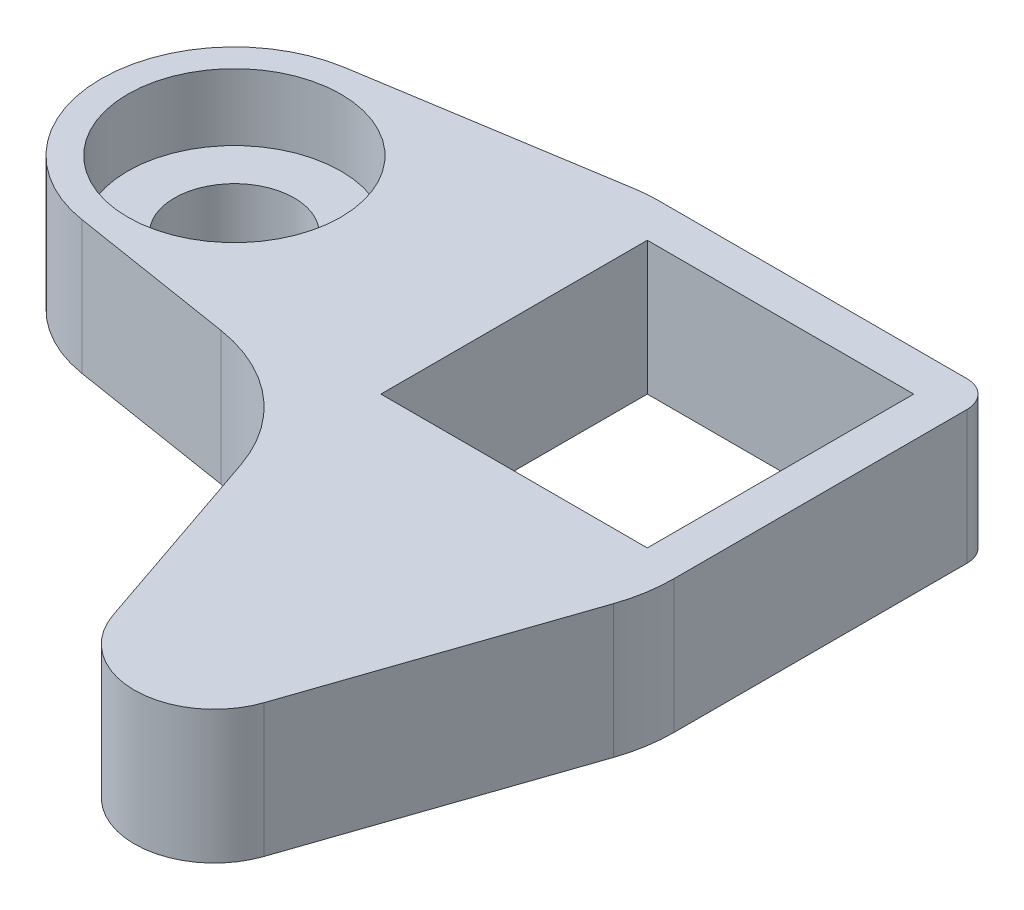
ISO-10303-21;
HEADER;
FILE_DESCRIPTION(('STEP AP214'),'2;1');
FILE_NAME('part.step','',(''),(''),'','','');
FILE_SCHEMA(('AUTOMOTIVE_DESIGN { 1 0 10303 214 1 1 1 1 }'));
ENDSEC;
DATA;
#1=APPLICATION_CONTEXT('core data for automotive mechanical design processes');
#2=APPLICATION_PROTOCOL_DEFINITION('international standard','automotive_design',2000,#1);
#3=PRODUCT_CONTEXT('',#1,'mechanical');
#4=PRODUCT('Part','Part','',(#3));
#5=PRODUCT_RELATED_PRODUCT_CATEGORY('part','',(#4));
#6=PRODUCT_DEFINITION_FORMATION('','',#4);
#7=PRODUCT_DEFINITION_CONTEXT('part definition',#1,'design');
#8=PRODUCT_DEFINITION('design','',#6,#7);
#9=PRODUCT_DEFINITION_SHAPE('','',#8);
#10=(LENGTH_UNIT() NAMED_UNIT(*) SI_UNIT(.MILLI.,.METRE.));
#11=(NAMED_UNIT(*) PLANE_ANGLE_UNIT() SI_UNIT($,.RADIAN.));
#12=(NAMED_UNIT(*) SI_UNIT($,.STERADIAN.) SOLID_ANGLE_UNIT());
#13=UNCERTAINTY_MEASURE_WITH_UNIT(LENGTH_MEASURE(1.E-05),#10,'distance_accuracy_value','');
#14=(GEOMETRIC_REPRESENTATION_CONTEXT(3) GLOBAL_UNCERTAINTY_ASSIGNED_CONTEXT((#13)) GLOBAL_UNIT_ASSIGNED_CONTEXT((#10,
#11,#12)) REPRESENTATION_CONTEXT('',''));
#15=CARTESIAN_POINT('',(0.,0.,0.));
#16=DIRECTION('',(0.,0.,1.));
#17=DIRECTION('',(1.,0.,0.));
#18=AXIS2_PLACEMENT_3D('',#15,#16,#17);
#19=CARTESIAN_POINT('',(-5.,10.,-1.));
#20=DIRECTION('',(0.,-1.,0.));
#21=DIRECTION('',(0.,0.,-1.));
#22=AXIS2_PLACEMENT_3D('',#19,#20,#21);
#23=PLANE('',#22);
#24=CARTESIAN_POINT('',(-47.,10.,10.));
#25=DIRECTION('',(0.,1.,0.));
#26=DIRECTION('',(0.,0.,-1.));
#27=AXIS2_PLACEMENT_3D('',#24,#25,#26);
#28=CIRCLE('',#27,8.);
#29=CARTESIAN_POINT('',(-47.,10.,2.00000000000001));
#30=VERTEX_POINT('',#29);
#31=EDGE_CURVE('E202',#30,#30,#28,.F.);
#32=ORIENTED_EDGE('',*,*,#31,.T.);
#33=EDGE_LOOP('',(#32));
#34=FACE_BOUND('',#33,.T.);
#35=CARTESIAN_POINT('',(-5.,10.,-1.));
#36=DIRECTION('',(0.,-1.,0.));
#37=DIRECTION('',(0.,0.,-1.));
#38=AXIS2_PLACEMENT_3D('',#35,#36,#37);
#39=CIRCLE('',#38,2.);
#40=CARTESIAN_POINT('',(-5.,10.,-3.));
#41=VERTEX_POINT('',#40);
#42=CARTESIAN_POINT('',(-3.,10.,-1.));
#43=VERTEX_POINT('',#42);
#44=EDGE_CURVE('E213',#41,#43,#39,.T.);
#45=ORIENTED_EDGE('',*,*,#44,.F.);
#46=DIRECTION('',(1.,0.,0.));
#47=VECTOR('',#46,1.);
#48=CARTESIAN_POINT('',(-5.,10.,-3.));
#49=LINE('',#48,#47);
#50=CARTESIAN_POINT('',(-28.0482290774266,10.,-3.));
#51=VERTEX_POINT('',#50);
#52=EDGE_CURVE('E258',#51,#41,#49,.T.);
#53=ORIENTED_EDGE('',*,*,#52,.F.);
#54=CARTESIAN_POINT('',(-28.0482290774266,10.,9.));
#55=DIRECTION('',(0.,-1.,0.));
#56=DIRECTION('',(0.,0.,1.));
#57=AXIS2_PLACEMENT_3D('',#54,#55,#56);
#58=CIRCLE('',#57,12.);
#59=CARTESIAN_POINT('',(-29.9398710771213,10.,-2.849965845731));
#60=VERTEX_POINT('',#59);
#61=EDGE_CURVE('E254',#60,#51,#58,.T.);
#62=ORIENTED_EDGE('',*,*,#61,.F.);
#63=DIRECTION('',(0.987497153810917,0.,-0.157636833307885));
#64=VECTOR('',#63,1.);
#65=CARTESIAN_POINT('',(-29.9398710771213,10.,-2.849965845731));
#66=LINE('',#65,#64);
#67=CARTESIAN_POINT('',(-48.5763683330788,10.,0.125028461890824));
#68=VERTEX_POINT('',#67);
#69=EDGE_CURVE('E250',#68,#60,#66,.T.);
#70=ORIENTED_EDGE('',*,*,#69,.F.);
#71=CARTESIAN_POINT('',(-47.,10.,10.));
#72=DIRECTION('',(0.,-1.,0.));
#73=DIRECTION('',(0.,0.,1.));
#74=AXIS2_PLACEMENT_3D('',#71,#72,#73);
#75=CIRCLE('',#74,10.);
#76=CARTESIAN_POINT('',(-48.5763683330788,10.,19.8749715381092));
#77=VERTEX_POINT('',#76);
#78=EDGE_CURVE('E246',#77,#68,#75,.T.);
#79=ORIENTED_EDGE('',*,*,#78,.F.);
#80=DIRECTION('',(-0.987497153810917,0.,-0.157636833307885));
#81=VECTOR('',#80,1.);
#82=CARTESIAN_POINT('',(-36.1305887585279,10.,21.861724889862));
#83=LINE('',#82,#81);
#84=CARTESIAN_POINT('',(-36.1305887585279,10.,21.861724889862));
#85=VERTEX_POINT('',#84);
#86=EDGE_CURVE('E242',#85,#77,#83,.T.);
#87=ORIENTED_EDGE('',*,*,#86,.F.);
#88=CARTESIAN_POINT('',(-38.0222307582225,10.,33.711690735593));
#89=DIRECTION('',(0.,1.,0.));
#90=DIRECTION('',(0.,0.,1.));
#91=AXIS2_PLACEMENT_3D('',#88,#89,#90);
#92=CIRCLE('',#91,12.);
#93=CARTESIAN_POINT('',(-26.6662452592514,10.,29.8333414285865));
#94=VERTEX_POINT('',#93);
#95=EDGE_CURVE('E238',#94,#85,#92,.T.);
#96=ORIENTED_EDGE('',*,*,#95,.F.);
#97=DIRECTION('',(-0.323195775583867,0.,-0.946332124914262));
#98=VECTOR('',#97,1.);
#99=CARTESIAN_POINT('',(-26.6662452592514,10.,29.8333414285865));
#100=LINE('',#99,#98);
#101=CARTESIAN_POINT('',(-21.6779927494856,10.,44.4391746535032));
#102=VERTEX_POINT('',#101);
#103=EDGE_CURVE('E234',#102,#94,#100,.T.);
#104=ORIENTED_EDGE('',*,*,#103,.F.);
#105=CARTESIAN_POINT('',(-16.,10.,42.5));
#106=DIRECTION('',(0.,-1.,0.));
#107=DIRECTION('',(0.,0.,1.));
#108=AXIS2_PLACEMENT_3D('',#105,#106,#107);
#109=CIRCLE('',#108,6.);
#110=CARTESIAN_POINT('',(-10.3220072505144,10.,44.4391746535032));
#111=VERTEX_POINT('',#110);
#112=EDGE_CURVE('E230',#111,#102,#109,.T.);
#113=ORIENTED_EDGE('',*,*,#112,.F.);
#114=DIRECTION('',(-0.323195775583867,0.,0.946332124914262));
#115=VECTOR('',#114,1.);
#116=CARTESIAN_POINT('',(-3.64401450102886,10.,24.885704137479));
#117=LINE('',#116,#115);
#118=CARTESIAN_POINT('',(-3.64401450102885,10.,24.885704137479));
#119=VERTEX_POINT('',#118);
#120=EDGE_CURVE('E226',#119,#111,#117,.T.);
#121=ORIENTED_EDGE('',*,*,#120,.F.);
#122=CARTESIAN_POINT('',(-15.,10.,21.0073548304726));
#123=DIRECTION('',(0.,-1.,0.));
#124=DIRECTION('',(0.,0.,1.));
#125=AXIS2_PLACEMENT_3D('',#122,#123,#124);
#126=CIRCLE('',#125,12.);
#127=CARTESIAN_POINT('',(-3.,10.,21.0073548304726));
#128=VERTEX_POINT('',#127);
#129=EDGE_CURVE('E222',#128,#119,#126,.T.);
#130=ORIENTED_EDGE('',*,*,#129,.F.);
#131=DIRECTION('',(0.,0.,1.));
#132=VECTOR('',#131,1.);
#133=CARTESIAN_POINT('',(-3.,10.,21.0073548304726));
#134=LINE('',#133,#132);
#135=EDGE_CURVE('E217',#43,#128,#134,.T.);
#136=ORIENTED_EDGE('',*,*,#135,.F.);
#137=EDGE_LOOP('',(#45,#53,#62,#70,#79,#87,#96,#104,#113,#121,#130,#136));
#138=FACE_BOUND('',#137,.T.);
#139=DIRECTION('',(0.,0.,-1.));
#140=VECTOR('',#139,1.);
#141=CARTESIAN_POINT('',(-26.,10.,20.));
#142=LINE('',#141,#140);
#143=CARTESIAN_POINT('',(-26.,10.,20.));
#144=VERTEX_POINT('',#143);
#145=CARTESIAN_POINT('',(-26.,10.,0.));
#146=VERTEX_POINT('',#145);
#147=EDGE_CURVE('E165',#144,#146,#142,.T.);
#148=ORIENTED_EDGE('',*,*,#147,.T.);
#149=DIRECTION('',(1.,0.,0.));
#150=VECTOR('',#149,1.);
#151=CARTESIAN_POINT('',(-6.,10.,0.));
#152=LINE('',#151,#150);
#153=CARTESIAN_POINT('',(-6.,10.,0.));
#154=VERTEX_POINT('',#153);
#155=EDGE_CURVE('E175',#146,#154,#152,.T.);
#156=ORIENTED_EDGE('',*,*,#155,.T.);
#157=DIRECTION('',(0.,0.,1.));
#158=VECTOR('',#157,1.);
#159=CARTESIAN_POINT('',(-6.,10.,20.));
#160=LINE('',#159,#158);
#161=CARTESIAN_POINT('',(-6.,10.,20.));
#162=VERTEX_POINT('',#161);
#163=EDGE_CURVE('E180',#154,#162,#160,.T.);
#164=ORIENTED_EDGE('',*,*,#163,.T.);
#165=DIRECTION('',(-1.,0.,0.));
#166=VECTOR('',#165,1.);
#167=CARTESIAN_POINT('',(-6.,10.,20.));
#168=LINE('',#167,#166);
#169=EDGE_CURVE('E183',#162,#144,#168,.T.);
#170=ORIENTED_EDGE('',*,*,#169,.T.);
#171=EDGE_LOOP('',(#148,#156,#164,#170));
#172=FACE_BOUND('',#171,.T.);
#173=ADVANCED_FACE('F47',(#34,#138,#172),#23,.F.);
#174=CARTESIAN_POINT('',(-5.,0.,-1.));
#175=DIRECTION('',(0.,-1.,0.));
#176=DIRECTION('',(0.,0.,-1.));
#177=AXIS2_PLACEMENT_3D('',#174,#175,#176);
#178=PLANE('',#177);
#179=CARTESIAN_POINT('',(-16.,0.,42.5));
#180=DIRECTION('',(0.,1.,0.));
#181=DIRECTION('',(0.,0.,-1.));
#182=AXIS2_PLACEMENT_3D('',#179,#180,#181);
#183=CIRCLE('',#182,4.00000000000001);
#184=CARTESIAN_POINT('',(-16.,0.,38.5));
#185=VERTEX_POINT('',#184);
#186=EDGE_CURVE('E51',#185,#185,#183,.T.);
#187=ORIENTED_EDGE('',*,*,#186,.T.);
#188=EDGE_LOOP('',(#187));
#189=FACE_BOUND('',#188,.T.);
#190=CARTESIAN_POINT('',(-47.,0.,10.));
#191=DIRECTION('',(0.,1.,0.));
#192=DIRECTION('',(0.,0.,-1.));
#193=AXIS2_PLACEMENT_3D('',#190,#191,#192);
#194=CIRCLE('',#193,4.5);
#195=CARTESIAN_POINT('',(-47.,0.,5.5));
#196=VERTEX_POINT('',#195);
#197=EDGE_CURVE('E342',#196,#196,#194,.T.);
#198=ORIENTED_EDGE('',*,*,#197,.T.);
#199=EDGE_LOOP('',(#198));
#200=FACE_BOUND('',#199,.T.);
#201=CARTESIAN_POINT('',(-5.,0.,-1.));
#202=DIRECTION('',(0.,-1.,0.));
#203=DIRECTION('',(0.,0.,-1.));
#204=AXIS2_PLACEMENT_3D('',#201,#202,#203);
#205=CIRCLE('',#204,2.);
#206=CARTESIAN_POINT('',(-5.,0.,-3.));
#207=VERTEX_POINT('',#206);
#208=CARTESIAN_POINT('',(-3.,0.,-1.));
#209=VERTEX_POINT('',#208);
#210=EDGE_CURVE('E171',#207,#209,#205,.T.);
#211=ORIENTED_EDGE('',*,*,#210,.T.);
#212=DIRECTION('',(0.,0.,1.));
#213=VECTOR('',#212,1.);
#214=CARTESIAN_POINT('',(-3.,0.,21.0073548304726));
#215=LINE('',#214,#213);
#216=CARTESIAN_POINT('',(-3.,0.,21.0073548304726));
#217=VERTEX_POINT('',#216);
#218=EDGE_CURVE('E266',#209,#217,#215,.T.);
#219=ORIENTED_EDGE('',*,*,#218,.T.);
#220=CARTESIAN_POINT('',(-15.,0.,21.0073548304726));
#221=DIRECTION('',(0.,-1.,0.));
#222=DIRECTION('',(0.,0.,1.));
#223=AXIS2_PLACEMENT_3D('',#220,#221,#222);
#224=CIRCLE('',#223,12.);
#225=CARTESIAN_POINT('',(-3.64401450102885,0.,24.885704137479));
#226=VERTEX_POINT('',#225);
#227=EDGE_CURVE('E270',#217,#226,#224,.T.);
#228=ORIENTED_EDGE('',*,*,#227,.T.);
#229=DIRECTION('',(-0.323195775583867,0.,0.946332124914262));
#230=VECTOR('',#229,1.);
#231=CARTESIAN_POINT('',(-3.64401450102886,0.,24.885704137479));
#232=LINE('',#231,#230);
#233=CARTESIAN_POINT('',(-10.3220072505144,0.,44.4391746535032));
#234=VERTEX_POINT('',#233);
#235=EDGE_CURVE('E274',#226,#234,#232,.T.);
#236=ORIENTED_EDGE('',*,*,#235,.T.);
#237=CARTESIAN_POINT('',(-16.,0.,42.5));
#238=DIRECTION('',(0.,-1.,0.));
#239=DIRECTION('',(0.,0.,1.));
#240=AXIS2_PLACEMENT_3D('',#237,#238,#239);
#241=CIRCLE('',#240,6.);
#242=CARTESIAN_POINT('',(-21.6779927494856,0.,44.4391746535032));
#243=VERTEX_POINT('',#242);
#244=EDGE_CURVE('E278',#234,#243,#241,.T.);
#245=ORIENTED_EDGE('',*,*,#244,.T.);
#246=DIRECTION('',(-0.323195775583867,0.,-0.946332124914262));
#247=VECTOR('',#246,1.);
#248=CARTESIAN_POINT('',(-26.6662452592514,0.,29.8333414285865));
#249=LINE('',#248,#247);
#250=CARTESIAN_POINT('',(-26.6662452592514,0.,29.8333414285865));
#251=VERTEX_POINT('',#250);
#252=EDGE_CURVE('E282',#243,#251,#249,.T.);
#253=ORIENTED_EDGE('',*,*,#252,.T.);
#254=CARTESIAN_POINT('',(-38.0222307582225,0.,33.711690735593));
#255=DIRECTION('',(0.,1.,0.));
#256=DIRECTION('',(0.,0.,1.));
#257=AXIS2_PLACEMENT_3D('',#254,#255,#256);
#258=CIRCLE('',#257,12.);
#259=CARTESIAN_POINT('',(-36.1305887585279,0.,21.861724889862));
#260=VERTEX_POINT('',#259);
#261=EDGE_CURVE('E286',#251,#260,#258,.T.);
#262=ORIENTED_EDGE('',*,*,#261,.T.);
#263=DIRECTION('',(-0.987497153810917,0.,-0.157636833307885));
#264=VECTOR('',#263,1.);
#265=CARTESIAN_POINT('',(-36.1305887585279,0.,21.861724889862));
#266=LINE('',#265,#264);
#267=CARTESIAN_POINT('',(-48.5763683330788,0.,19.8749715381092));
#268=VERTEX_POINT('',#267);
#269=EDGE_CURVE('E290',#260,#268,#266,.T.);
#270=ORIENTED_EDGE('',*,*,#269,.T.);
#271=CARTESIAN_POINT('',(-47.,0.,10.));
#272=DIRECTION('',(0.,-1.,0.));
#273=DIRECTION('',(0.,0.,1.));
#274=AXIS2_PLACEMENT_3D('',#271,#272,#273);
#275=CIRCLE('',#274,10.);
#276=CARTESIAN_POINT('',(-48.5763683330788,0.,0.125028461890824));
#277=VERTEX_POINT('',#276);
#278=EDGE_CURVE('E294',#268,#277,#275,.T.);
#279=ORIENTED_EDGE('',*,*,#278,.T.);
#280=DIRECTION('',(0.987497153810917,0.,-0.157636833307885));
#281=VECTOR('',#280,1.);
#282=CARTESIAN_POINT('',(-29.9398710771213,0.,-2.849965845731));
#283=LINE('',#282,#281);
#284=CARTESIAN_POINT('',(-29.9398710771213,0.,-2.849965845731));
#285=VERTEX_POINT('',#284);
#286=EDGE_CURVE('E298',#277,#285,#283,.T.);
#287=ORIENTED_EDGE('',*,*,#286,.T.);
#288=CARTESIAN_POINT('',(-28.0482290774266,0.,9.));
#289=DIRECTION('',(0.,-1.,0.));
#290=DIRECTION('',(0.,0.,1.));
#291=AXIS2_PLACEMENT_3D('',#288,#289,#290);
#292=CIRCLE('',#291,12.);
#293=CARTESIAN_POINT('',(-28.0482290774266,0.,-3.));
#294=VERTEX_POINT('',#293);
#295=EDGE_CURVE('E302',#285,#294,#292,.T.);
#296=ORIENTED_EDGE('',*,*,#295,.T.);
#297=DIRECTION('',(1.,0.,0.));
#298=VECTOR('',#297,1.);
#299=CARTESIAN_POINT('',(-5.,0.,-3.));
#300=LINE('',#299,#298);
#301=EDGE_CURVE('E218',#294,#207,#300,.T.);
#302=ORIENTED_EDGE('',*,*,#301,.T.);
#303=EDGE_LOOP('',(#211,#219,#228,#236,#245,#253,#262,#270,#279,#287,#296,#302));
#304=FACE_BOUND('',#303,.T.);
#305=DIRECTION('',(-1.,0.,0.));
#306=VECTOR('',#305,1.);
#307=CARTESIAN_POINT('',(-6.,0.,20.));
#308=LINE('',#307,#306);
#309=CARTESIAN_POINT('',(-6.,0.,20.));
#310=VERTEX_POINT('',#309);
#311=CARTESIAN_POINT('',(-26.,0.,20.));
#312=VERTEX_POINT('',#311);
#313=EDGE_CURVE('E185',#310,#312,#308,.T.);
#314=ORIENTED_EDGE('',*,*,#313,.F.);
#315=DIRECTION('',(0.,0.,1.));
#316=VECTOR('',#315,1.);
#317=CARTESIAN_POINT('',(-6.,0.,20.));
#318=LINE('',#317,#316);
#319=CARTESIAN_POINT('',(-6.,0.,0.));
#320=VERTEX_POINT('',#319);
#321=EDGE_CURVE('E189',#320,#310,#318,.T.);
#322=ORIENTED_EDGE('',*,*,#321,.F.);
#323=DIRECTION('',(1.,0.,0.));
#324=VECTOR('',#323,1.);
#325=CARTESIAN_POINT('',(-6.,0.,0.));
#326=LINE('',#325,#324);
#327=CARTESIAN_POINT('',(-26.,0.,0.));
#328=VERTEX_POINT('',#327);
#329=EDGE_CURVE('E201',#328,#320,#326,.T.);
#330=ORIENTED_EDGE('',*,*,#329,.F.);
#331=DIRECTION('',(0.,0.,-1.));
#332=VECTOR('',#331,1.);
#333=CARTESIAN_POINT('',(-26.,0.,20.));
#334=LINE('',#333,#332);
#335=EDGE_CURVE('E166',#312,#328,#334,.T.);
#336=ORIENTED_EDGE('',*,*,#335,.F.);
#337=EDGE_LOOP('',(#314,#322,#330,#336));
#338=FACE_BOUND('',#337,.T.);
#339=ADVANCED_FACE('F378',(#189,#200,#304,#338),#178,.T.);
#340=CARTESIAN_POINT('',(-5.,10.,-1.));
#341=DIRECTION('',(0.,-1.,0.));
#342=DIRECTION('',(0.,0.,-1.));
#343=AXIS2_PLACEMENT_3D('',#340,#341,#342);
#344=CYLINDRICAL_SURFACE('',#343,2.);
#345=ORIENTED_EDGE('',*,*,#210,.F.);
#346=DIRECTION('',(0.,-1.,0.));
#347=VECTOR('',#346,1.);
#348=CARTESIAN_POINT('',(-5.,10.,-3.));
#349=LINE('',#348,#347);
#350=EDGE_CURVE('E262',#41,#207,#349,.T.);
#351=ORIENTED_EDGE('',*,*,#350,.F.);
#352=ORIENTED_EDGE('',*,*,#44,.T.);
#353=DIRECTION('',(0.,-1.,0.));
#354=VECTOR('',#353,1.);
#355=CARTESIAN_POINT('',(-3.,10.,-1.));
#356=LINE('',#355,#354);
#357=EDGE_CURVE('E11',#43,#209,#356,.T.);
#358=ORIENTED_EDGE('',*,*,#357,.T.);
#359=EDGE_LOOP('',(#345,#351,#352,#358));
#360=FACE_BOUND('',#359,.T.);
#361=ADVANCED_FACE('F49',(#360),#344,.T.);
#362=CARTESIAN_POINT('',(-3.,10.,21.0073548304726));
#363=DIRECTION('',(-1.,0.,0.));
#364=DIRECTION('',(0.,0.,-1.));
#365=AXIS2_PLACEMENT_3D('',#362,#363,#364);
#366=PLANE('',#365);
#367=ORIENTED_EDGE('',*,*,#218,.F.);
#368=ORIENTED_EDGE('',*,*,#357,.F.);
#369=ORIENTED_EDGE('',*,*,#135,.T.);
#370=DIRECTION('',(0.,-1.,0.));
#371=VECTOR('',#370,1.);
#372=CARTESIAN_POINT('',(-3.,10.,21.0073548304726));
#373=LINE('',#372,#371);
#374=EDGE_CURVE('E57',#128,#217,#373,.T.);
#375=ORIENTED_EDGE('',*,*,#374,.T.);
#376=EDGE_LOOP('',(#367,#368,#369,#375));
#377=FACE_BOUND('',#376,.T.);
#378=ADVANCED_FACE('F428',(#377),#366,.F.);
#379=CARTESIAN_POINT('',(-15.,10.,21.0073548304726));
#380=DIRECTION('',(0.,-1.,0.));
#381=DIRECTION('',(0.,0.,-1.));
#382=AXIS2_PLACEMENT_3D('',#379,#380,#381);
#383=CYLINDRICAL_SURFACE('',#382,12.);
#384=ORIENTED_EDGE('',*,*,#227,.F.);
#385=ORIENTED_EDGE('',*,*,#374,.F.);
#386=ORIENTED_EDGE('',*,*,#129,.T.);
#387=DIRECTION('',(0.,-1.,0.));
#388=VECTOR('',#387,1.);
#389=CARTESIAN_POINT('',(-3.64401450102885,10.,24.885704137479));
#390=LINE('',#389,#388);
#391=EDGE_CURVE('E335',#119,#226,#390,.T.);
#392=ORIENTED_EDGE('',*,*,#391,.T.);
#393=EDGE_LOOP('',(#384,#385,#386,#392));
#394=FACE_BOUND('',#393,.T.);
#395=ADVANCED_FACE('F425',(#394),#383,.T.);
#396=CARTESIAN_POINT('',(-3.64401450102886,10.,24.885704137479));
#397=DIRECTION('',(-0.946332124914262,0.,-0.323195775583867));
#398=DIRECTION('',(0.323195775583867,0.,-0.946332124914262));
#399=AXIS2_PLACEMENT_3D('',#396,#397,#398);
#400=PLANE('',#399);
#401=ORIENTED_EDGE('',*,*,#235,.F.);
#402=ORIENTED_EDGE('',*,*,#391,.F.);
#403=ORIENTED_EDGE('',*,*,#120,.T.);
#404=DIRECTION('',(0.,-1.,0.));
#405=VECTOR('',#404,1.);
#406=CARTESIAN_POINT('',(-10.3220072505144,10.,44.4391746535032));
#407=LINE('',#406,#405);
#408=EDGE_CURVE('E332',#111,#234,#407,.T.);
#409=ORIENTED_EDGE('',*,*,#408,.T.);
#410=EDGE_LOOP('',(#401,#402,#403,#409));
#411=FACE_BOUND('',#410,.T.);
#412=ADVANCED_FACE('F421',(#411),#400,.F.);
#413=CARTESIAN_POINT('',(-16.,10.,42.5));
#414=DIRECTION('',(0.,-1.,0.));
#415=DIRECTION('',(0.,0.,-1.));
#416=AXIS2_PLACEMENT_3D('',#413,#414,#415);
#417=CYLINDRICAL_SURFACE('',#416,6.);
#418=ORIENTED_EDGE('',*,*,#244,.F.);
#419=ORIENTED_EDGE('',*,*,#408,.F.);
#420=ORIENTED_EDGE('',*,*,#112,.T.);
#421=DIRECTION('',(0.,-1.,0.));
#422=VECTOR('',#421,1.);
#423=CARTESIAN_POINT('',(-21.6779927494856,10.,44.4391746535032));
#424=LINE('',#423,#422);
#425=EDGE_CURVE('E329',#102,#243,#424,.T.);
#426=ORIENTED_EDGE('',*,*,#425,.T.);
#427=EDGE_LOOP('',(#418,#419,#420,#426));
#428=FACE_BOUND('',#427,.T.);
#429=ADVANCED_FACE('F417',(#428),#417,.T.);
#430=CARTESIAN_POINT('',(-26.6662452592514,10.,29.8333414285865));
#431=DIRECTION('',(0.946332124914262,0.,-0.323195775583867));
#432=DIRECTION('',(0.323195775583867,0.,0.946332124914262));
#433=AXIS2_PLACEMENT_3D('',#430,#431,#432);
#434=PLANE('',#433);
#435=ORIENTED_EDGE('',*,*,#252,.F.);
#436=ORIENTED_EDGE('',*,*,#425,.F.);
#437=ORIENTED_EDGE('',*,*,#103,.T.);
#438=DIRECTION('',(0.,-1.,0.));
#439=VECTOR('',#438,1.);
#440=CARTESIAN_POINT('',(-26.6662452592514,10.,29.8333414285865));
#441=LINE('',#440,#439);
#442=EDGE_CURVE('E326',#94,#251,#441,.T.);
#443=ORIENTED_EDGE('',*,*,#442,.T.);
#444=EDGE_LOOP('',(#435,#436,#437,#443));
#445=FACE_BOUND('',#444,.T.);
#446=ADVANCED_FACE('F413',(#445),#434,.F.);
#447=CARTESIAN_POINT('',(-38.0222307582225,10.,33.711690735593));
#448=DIRECTION('',(0.,-1.,0.));
#449=DIRECTION('',(0.,0.,-1.));
#450=AXIS2_PLACEMENT_3D('',#447,#448,#449);
#451=CYLINDRICAL_SURFACE('',#450,12.);
#452=ORIENTED_EDGE('',*,*,#261,.F.);
#453=ORIENTED_EDGE('',*,*,#442,.F.);
#454=ORIENTED_EDGE('',*,*,#95,.T.);
#455=DIRECTION('',(0.,-1.,0.));
#456=VECTOR('',#455,1.);
#457=CARTESIAN_POINT('',(-36.1305887585279,10.,21.861724889862));
#458=LINE('',#457,#456);
#459=EDGE_CURVE('E323',#85,#260,#458,.T.);
#460=ORIENTED_EDGE('',*,*,#459,.T.);
#461=EDGE_LOOP('',(#452,#453,#454,#460));
#462=FACE_BOUND('',#461,.T.);
#463=ADVANCED_FACE('F409',(#462),#451,.F.);
#464=CARTESIAN_POINT('',(-36.1305887585279,10.,21.861724889862));
#465=DIRECTION('',(0.157636833307885,0.,-0.987497153810917));
#466=DIRECTION('',(0.987497153810917,0.,0.157636833307885));
#467=AXIS2_PLACEMENT_3D('',#464,#465,#466);
#468=PLANE('',#467);
#469=ORIENTED_EDGE('',*,*,#269,.F.);
#470=ORIENTED_EDGE('',*,*,#459,.F.);
#471=ORIENTED_EDGE('',*,*,#86,.T.);
#472=DIRECTION('',(0.,-1.,0.));
#473=VECTOR('',#472,1.);
#474=CARTESIAN_POINT('',(-48.5763683330788,10.,19.8749715381092));
#475=LINE('',#474,#473);
#476=EDGE_CURVE('E320',#77,#268,#475,.T.);
#477=ORIENTED_EDGE('',*,*,#476,.T.);
#478=EDGE_LOOP('',(#469,#470,#471,#477));
#479=FACE_BOUND('',#478,.T.);
#480=ADVANCED_FACE('F405',(#479),#468,.F.);
#481=CARTESIAN_POINT('',(-47.,10.,10.));
#482=DIRECTION('',(0.,-1.,0.));
#483=DIRECTION('',(0.,0.,-1.));
#484=AXIS2_PLACEMENT_3D('',#481,#482,#483);
#485=CYLINDRICAL_SURFACE('',#484,10.);
#486=ORIENTED_EDGE('',*,*,#278,.F.);
#487=ORIENTED_EDGE('',*,*,#476,.F.);
#488=ORIENTED_EDGE('',*,*,#78,.T.);
#489=DIRECTION('',(0.,-1.,0.));
#490=VECTOR('',#489,1.);
#491=CARTESIAN_POINT('',(-48.5763683330788,10.,0.125028461890824));
#492=LINE('',#491,#490);
#493=EDGE_CURVE('E317',#68,#277,#492,.T.);
#494=ORIENTED_EDGE('',*,*,#493,.T.);
#495=EDGE_LOOP('',(#486,#487,#488,#494));
#496=FACE_BOUND('',#495,.T.);
#497=ADVANCED_FACE('F401',(#496),#485,.T.);
#498=CARTESIAN_POINT('',(-29.9398710771213,10.,-2.849965845731));
#499=DIRECTION('',(0.157636833307885,0.,0.987497153810917));
#500=DIRECTION('',(-0.987497153810917,0.,0.157636833307885));
#501=AXIS2_PLACEMENT_3D('',#498,#499,#500);
#502=PLANE('',#501);
#503=ORIENTED_EDGE('',*,*,#286,.F.);
#504=ORIENTED_EDGE('',*,*,#493,.F.);
#505=ORIENTED_EDGE('',*,*,#69,.T.);
#506=DIRECTION('',(0.,-1.,0.));
#507=VECTOR('',#506,1.);
#508=CARTESIAN_POINT('',(-29.9398710771213,10.,-2.849965845731));
#509=LINE('',#508,#507);
#510=EDGE_CURVE('E314',#60,#285,#509,.T.);
#511=ORIENTED_EDGE('',*,*,#510,.T.);
#512=EDGE_LOOP('',(#503,#504,#505,#511));
#513=FACE_BOUND('',#512,.T.);
#514=ADVANCED_FACE('F397',(#513),#502,.F.);
#515=CARTESIAN_POINT('',(-28.0482290774266,10.,9.));
#516=DIRECTION('',(0.,-1.,0.));
#517=DIRECTION('',(0.,0.,-1.));
#518=AXIS2_PLACEMENT_3D('',#515,#516,#517);
#519=CYLINDRICAL_SURFACE('',#518,12.);
#520=ORIENTED_EDGE('',*,*,#295,.F.);
#521=ORIENTED_EDGE('',*,*,#510,.F.);
#522=ORIENTED_EDGE('',*,*,#61,.T.);
#523=DIRECTION('',(0.,-1.,0.));
#524=VECTOR('',#523,1.);
#525=CARTESIAN_POINT('',(-28.0482290774266,10.,-3.));
#526=LINE('',#525,#524);
#527=EDGE_CURVE('E311',#51,#294,#526,.T.);
#528=ORIENTED_EDGE('',*,*,#527,.T.);
#529=EDGE_LOOP('',(#520,#521,#522,#528));
#530=FACE_BOUND('',#529,.T.);
#531=ADVANCED_FACE('F393',(#530),#519,.T.);
#532=CARTESIAN_POINT('',(-5.,10.,-3.));
#533=DIRECTION('',(0.,0.,1.));
#534=DIRECTION('',(-1.,0.,0.));
#535=AXIS2_PLACEMENT_3D('',#532,#533,#534);
#536=PLANE('',#535);
#537=ORIENTED_EDGE('',*,*,#301,.F.);
#538=ORIENTED_EDGE('',*,*,#527,.F.);
#539=ORIENTED_EDGE('',*,*,#52,.T.);
#540=ORIENTED_EDGE('',*,*,#350,.T.);
#541=EDGE_LOOP('',(#537,#538,#539,#540));
#542=FACE_BOUND('',#541,.T.);
#543=ADVANCED_FACE('F390',(#542),#536,.F.);
#544=CARTESIAN_POINT('',(-26.,10.,20.));
#545=DIRECTION('',(1.,0.,0.));
#546=DIRECTION('',(0.,0.,1.));
#547=AXIS2_PLACEMENT_3D('',#544,#545,#546);
#548=PLANE('',#547);
#549=ORIENTED_EDGE('',*,*,#335,.T.);
#550=DIRECTION('',(0.,-1.,0.));
#551=VECTOR('',#550,1.);
#552=CARTESIAN_POINT('',(-26.,10.,0.));
#553=LINE('',#552,#551);
#554=EDGE_CURVE('E161',#146,#328,#553,.T.);
#555=ORIENTED_EDGE('',*,*,#554,.F.);
#556=ORIENTED_EDGE('',*,*,#147,.F.);
#557=DIRECTION('',(0.,-1.,0.));
#558=VECTOR('',#557,1.);
#559=CARTESIAN_POINT('',(-26.,10.,20.));
#560=LINE('',#559,#558);
#561=EDGE_CURVE('E73',#144,#312,#560,.T.);
#562=ORIENTED_EDGE('',*,*,#561,.T.);
#563=EDGE_LOOP('',(#549,#555,#556,#562));
#564=FACE_BOUND('',#563,.T.);
#565=ADVANCED_FACE('F163',(#564),#548,.T.);
#566=CARTESIAN_POINT('',(-6.,10.,0.));
#567=DIRECTION('',(0.,0.,1.));
#568=DIRECTION('',(-1.,0.,0.));
#569=AXIS2_PLACEMENT_3D('',#566,#567,#568);
#570=PLANE('',#569);
#571=ORIENTED_EDGE('',*,*,#329,.T.);
#572=DIRECTION('',(0.,-1.,0.));
#573=VECTOR('',#572,1.);
#574=CARTESIAN_POINT('',(-6.,10.,0.));
#575=LINE('',#574,#573);
#576=EDGE_CURVE('E172',#154,#320,#575,.T.);
#577=ORIENTED_EDGE('',*,*,#576,.F.);
#578=ORIENTED_EDGE('',*,*,#155,.F.);
#579=ORIENTED_EDGE('',*,*,#554,.T.);
#580=EDGE_LOOP('',(#571,#577,#578,#579));
#581=FACE_BOUND('',#580,.T.);
#582=ADVANCED_FACE('F176',(#581),#570,.T.);
#583=CARTESIAN_POINT('',(-6.,10.,20.));
#584=DIRECTION('',(-1.,0.,0.));
#585=DIRECTION('',(0.,0.,-1.));
#586=AXIS2_PLACEMENT_3D('',#583,#584,#585);
#587=PLANE('',#586);
#588=ORIENTED_EDGE('',*,*,#321,.T.);
#589=DIRECTION('',(0.,-1.,0.));
#590=VECTOR('',#589,1.);
#591=CARTESIAN_POINT('',(-6.,10.,20.));
#592=LINE('',#591,#590);
#593=EDGE_CURVE('E65',#162,#310,#592,.T.);
#594=ORIENTED_EDGE('',*,*,#593,.F.);
#595=ORIENTED_EDGE('',*,*,#163,.F.);
#596=ORIENTED_EDGE('',*,*,#576,.T.);
#597=EDGE_LOOP('',(#588,#594,#595,#596));
#598=FACE_BOUND('',#597,.T.);
#599=ADVANCED_FACE('F466',(#598),#587,.T.);
#600=CARTESIAN_POINT('',(-6.,10.,20.));
#601=DIRECTION('',(0.,0.,-1.));
#602=DIRECTION('',(1.,0.,0.));
#603=AXIS2_PLACEMENT_3D('',#600,#601,#602);
#604=PLANE('',#603);
#605=ORIENTED_EDGE('',*,*,#313,.T.);
#606=ORIENTED_EDGE('',*,*,#561,.F.);
#607=ORIENTED_EDGE('',*,*,#169,.F.);
#608=ORIENTED_EDGE('',*,*,#593,.T.);
#609=EDGE_LOOP('',(#605,#606,#607,#608));
#610=FACE_BOUND('',#609,.T.);
#611=ADVANCED_FACE('F465',(#610),#604,.T.);
#612=CARTESIAN_POINT('',(-47.,51.,10.));
#613=DIRECTION('',(0.,-1.,0.));
#614=DIRECTION('',(0.,0.,-1.));
#615=AXIS2_PLACEMENT_3D('',#612,#613,#614);
#616=CYLINDRICAL_SURFACE('',#615,8.);
#617=CARTESIAN_POINT('',(-47.,5.,10.));
#618=DIRECTION('',(0.,-1.,0.));
#619=DIRECTION('',(0.,0.,1.));
#620=AXIS2_PLACEMENT_3D('',#617,#618,#619);
#621=CIRCLE('',#620,8.);
#622=CARTESIAN_POINT('',(-47.,5.,18.));
#623=VERTEX_POINT('',#622);
#624=EDGE_CURVE('E192',#623,#623,#621,.T.);
#625=ORIENTED_EDGE('',*,*,#624,.T.);
#626=EDGE_LOOP('',(#625));
#627=FACE_BOUND('',#626,.T.);
#628=ORIENTED_EDGE('',*,*,#31,.F.);
#629=EDGE_LOOP('',(#628));
#630=FACE_BOUND('',#629,.T.);
#631=ADVANCED_FACE('F375',(#627,#630),#616,.F.);
#632=CARTESIAN_POINT('',(-47.,5.,10.));
#633=DIRECTION('',(0.,1.,0.));
#634=DIRECTION('',(0.,0.,1.));
#635=AXIS2_PLACEMENT_3D('',#632,#633,#634);
#636=PLANE('',#635);
#637=CARTESIAN_POINT('',(-47.,5.,10.));
#638=DIRECTION('',(0.,-1.,0.));
#639=DIRECTION('',(0.,0.,-1.));
#640=AXIS2_PLACEMENT_3D('',#637,#638,#639);
#641=CIRCLE('',#640,4.5);
#642=CARTESIAN_POINT('',(-47.,5.,5.5));
#643=VERTEX_POINT('',#642);
#644=EDGE_CURVE('E352',#643,#643,#641,.T.);
#645=ORIENTED_EDGE('',*,*,#644,.T.);
#646=EDGE_LOOP('',(#645));
#647=FACE_BOUND('',#646,.T.);
#648=ORIENTED_EDGE('',*,*,#624,.F.);
#649=EDGE_LOOP('',(#648));
#650=FACE_BOUND('',#649,.T.);
#651=ADVANCED_FACE('F360',(#647,#650),#636,.T.);
#652=CARTESIAN_POINT('',(-47.,-5.,10.));
#653=DIRECTION('',(0.,1.,0.));
#654=DIRECTION('',(0.,0.,1.));
#655=AXIS2_PLACEMENT_3D('',#652,#653,#654);
#656=CYLINDRICAL_SURFACE('',#655,4.5);
#657=ORIENTED_EDGE('',*,*,#197,.F.);
#658=EDGE_LOOP('',(#657));
#659=FACE_BOUND('',#658,.T.);
#660=ORIENTED_EDGE('',*,*,#644,.F.);
#661=EDGE_LOOP('',(#660));
#662=FACE_BOUND('',#661,.T.);
#663=ADVANCED_FACE('F363',(#659,#662),#656,.F.);
#664=CARTESIAN_POINT('',(-16.,-5.,42.5));
#665=DIRECTION('',(0.,1.,0.));
#666=DIRECTION('',(0.,0.,1.));
#667=AXIS2_PLACEMENT_3D('',#664,#665,#666);
#668=CYLINDRICAL_SURFACE('',#667,4.00000000000001);
#669=ORIENTED_EDGE('',*,*,#186,.F.);
#670=EDGE_LOOP('',(#669));
#671=FACE_BOUND('',#670,.T.);
#672=CARTESIAN_POINT('',(-16.,5.,42.5));
#673=DIRECTION('',(0.,-1.,0.));
#674=DIRECTION('',(0.,0.,-1.));
#675=AXIS2_PLACEMENT_3D('',#672,#673,#674);
#676=CIRCLE('',#675,4.00000000000001);
#677=CARTESIAN_POINT('',(-16.,5.,38.5));
#678=VERTEX_POINT('',#677);
#679=EDGE_CURVE('E345',#678,#678,#676,.T.);
#680=ORIENTED_EDGE('',*,*,#679,.F.);
#681=EDGE_LOOP('',(#680));
#682=FACE_BOUND('',#681,.T.);
#683=ADVANCED_FACE('F365',(#671,#682),#668,.F.);
#684=CARTESIAN_POINT('',(-16.,5.,42.5));
#685=DIRECTION('',(0.,-1.,0.));
#686=DIRECTION('',(0.,0.,-1.));
#687=AXIS2_PLACEMENT_3D('',#684,#685,#686);
#688=PLANE('',#687);
#689=ORIENTED_EDGE('',*,*,#679,.T.);
#690=EDGE_LOOP('',(#689));
#691=FACE_BOUND('',#690,.T.);
#692=ADVANCED_FACE('F372',(#691),#688,.T.);
#693=CLOSED_SHELL('',(#173,#339,#361,#378,#395,#412,#429,#446,#463,#480,#497,#514,#531,#543,
#565,#582,#599,#611,#631,#651,#663,#683,#692));
#694=MANIFOLD_SOLID_BREP('B2',#693);
#695=ADVANCED_BREP_SHAPE_REPRESENTATION('',(#18,#694),#14);
#696=SHAPE_DEFINITION_REPRESENTATION(#9,#695);
ENDSEC;
END-ISO-10303-21;
